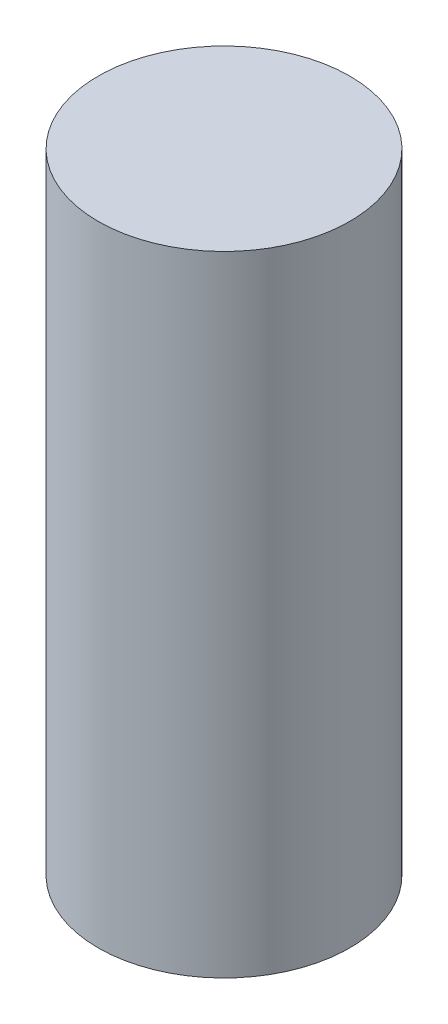
ISO-10303-21;
HEADER;
FILE_DESCRIPTION(('STEP AP214'),'2;1');
FILE_NAME('part.step','',(''),(''),'','','');
FILE_SCHEMA(('AUTOMOTIVE_DESIGN { 1 0 10303 214 1 1 1 1 }'));
ENDSEC;
DATA;
#1=APPLICATION_CONTEXT('core data for automotive mechanical design processes');
#2=APPLICATION_PROTOCOL_DEFINITION('international standard','automotive_design',2000,#1);
#3=PRODUCT_CONTEXT('',#1,'mechanical');
#4=PRODUCT('Part','Part','',(#3));
#5=PRODUCT_RELATED_PRODUCT_CATEGORY('part','',(#4));
#6=PRODUCT_DEFINITION_FORMATION('','',#4);
#7=PRODUCT_DEFINITION_CONTEXT('part definition',#1,'design');
#8=PRODUCT_DEFINITION('design','',#6,#7);
#9=PRODUCT_DEFINITION_SHAPE('','',#8);
#10=(LENGTH_UNIT() NAMED_UNIT(*) SI_UNIT(.MILLI.,.METRE.));
#11=(NAMED_UNIT(*) PLANE_ANGLE_UNIT() SI_UNIT($,.RADIAN.));
#12=(NAMED_UNIT(*) SI_UNIT($,.STERADIAN.) SOLID_ANGLE_UNIT());
#13=UNCERTAINTY_MEASURE_WITH_UNIT(LENGTH_MEASURE(1.E-05),#10,'distance_accuracy_value','');
#14=(GEOMETRIC_REPRESENTATION_CONTEXT(3) GLOBAL_UNCERTAINTY_ASSIGNED_CONTEXT((#13)) GLOBAL_UNIT_ASSIGNED_CONTEXT((#10,
#11,#12)) REPRESENTATION_CONTEXT('',''));
#15=CARTESIAN_POINT('',(0.,0.,0.));
#16=DIRECTION('',(0.,0.,1.));
#17=DIRECTION('',(1.,0.,0.));
#18=AXIS2_PLACEMENT_3D('',#15,#16,#17);
#19=CARTESIAN_POINT('',(0.,1000.,0.));
#20=DIRECTION('',(0.,1.,0.));
#21=DIRECTION('',(0.,0.,1.));
#22=AXIS2_PLACEMENT_3D('',#19,#20,#21);
#23=PLANE('',#22);
#24=CARTESIAN_POINT('',(0.,1000.,0.));
#25=DIRECTION('',(0.,-1.,0.));
#26=DIRECTION('',(0.,0.,-1.));
#27=AXIS2_PLACEMENT_3D('',#24,#25,#26);
#28=CIRCLE('',#27,200.);
#29=CARTESIAN_POINT('',(0.,1000.,-200.));
#30=VERTEX_POINT('',#29);
#31=EDGE_CURVE('E10',#30,#30,#28,.T.);
#32=ORIENTED_EDGE('',*,*,#31,.F.);
#33=EDGE_LOOP('',(#32));
#34=FACE_BOUND('',#33,.T.);
#35=ADVANCED_FACE('F39',(#34),#23,.T.);
#36=CARTESIAN_POINT('',(0.,0.,0.));
#37=DIRECTION('',(0.,-1.,0.));
#38=DIRECTION('',(0.,0.,-1.));
#39=AXIS2_PLACEMENT_3D('',#36,#37,#38);
#40=CYLINDRICAL_SURFACE('',#39,200.);
#41=ORIENTED_EDGE('',*,*,#31,.T.);
#42=EDGE_LOOP('',(#41));
#43=FACE_BOUND('',#42,.T.);
#44=CARTESIAN_POINT('',(0.,0.,0.));
#45=DIRECTION('',(0.,-1.,0.));
#46=DIRECTION('',(0.,0.,-1.));
#47=AXIS2_PLACEMENT_3D('',#44,#45,#46);
#48=CIRCLE('',#47,200.);
#49=CARTESIAN_POINT('',(0.,0.,-200.));
#50=VERTEX_POINT('',#49);
#51=EDGE_CURVE('E45',#50,#50,#48,.T.);
#52=ORIENTED_EDGE('',*,*,#51,.F.);
#53=EDGE_LOOP('',(#52));
#54=FACE_BOUND('',#53,.T.);
#55=ADVANCED_FACE('F53',(#43,#54),#40,.T.);
#56=CARTESIAN_POINT('',(0.,0.,0.));
#57=DIRECTION('',(0.,-1.,0.));
#58=DIRECTION('',(0.,0.,-1.));
#59=AXIS2_PLACEMENT_3D('',#56,#57,#58);
#60=PLANE('',#59);
#61=ORIENTED_EDGE('',*,*,#51,.T.);
#62=EDGE_LOOP('',(#61));
#63=FACE_BOUND('',#62,.T.);
#64=ADVANCED_FACE('F51',(#63),#60,.T.);
#65=CLOSED_SHELL('',(#35,#55,#64));
#66=MANIFOLD_SOLID_BREP('B2',#65);
#67=ADVANCED_BREP_SHAPE_REPRESENTATION('',(#18,#66),#14);
#68=SHAPE_DEFINITION_REPRESENTATION(#9,#67);
ENDSEC;
END-ISO-10303-21;
